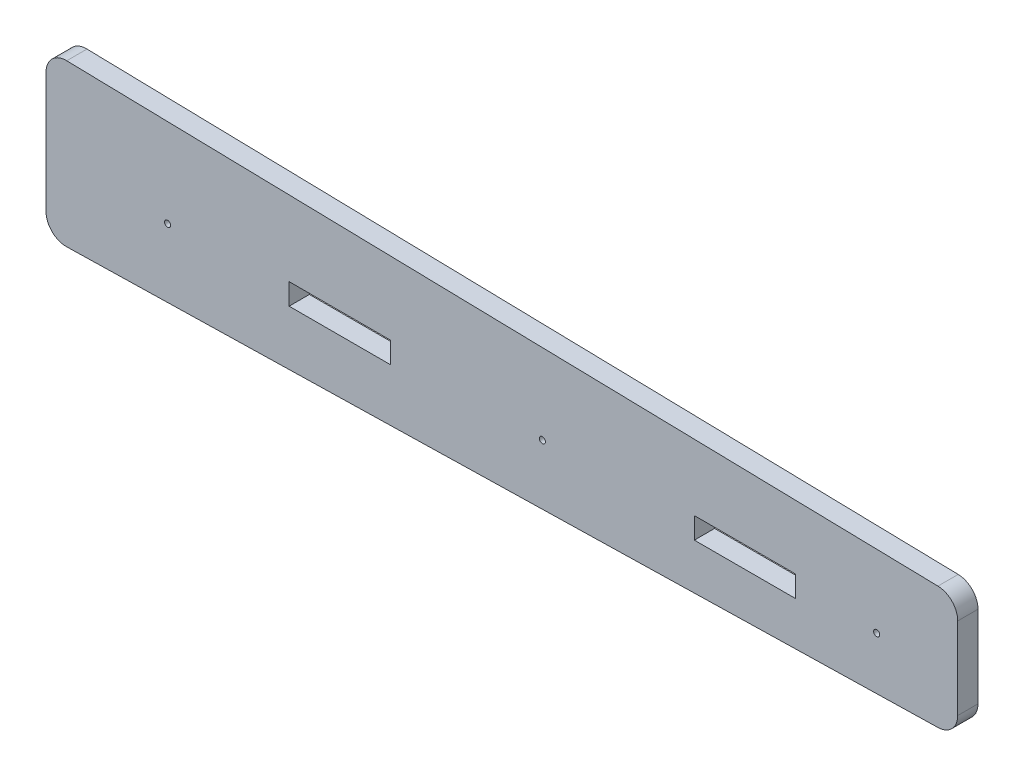
ISO-10303-21;
HEADER;
FILE_DESCRIPTION(('STEP AP214'),'2;1');
FILE_NAME('part.step','',(''),(''),'','','');
FILE_SCHEMA(('AUTOMOTIVE_DESIGN { 1 0 10303 214 1 1 1 1 }'));
ENDSEC;
DATA;
#1=APPLICATION_CONTEXT('core data for automotive mechanical design processes');
#2=APPLICATION_PROTOCOL_DEFINITION('international standard','automotive_design',2000,#1);
#3=PRODUCT_CONTEXT('',#1,'mechanical');
#4=PRODUCT('Part','Part','',(#3));
#5=PRODUCT_RELATED_PRODUCT_CATEGORY('part','',(#4));
#6=PRODUCT_DEFINITION_FORMATION('','',#4);
#7=PRODUCT_DEFINITION_CONTEXT('part definition',#1,'design');
#8=PRODUCT_DEFINITION('design','',#6,#7);
#9=PRODUCT_DEFINITION_SHAPE('','',#8);
#10=(LENGTH_UNIT() NAMED_UNIT(*) SI_UNIT(.MILLI.,.METRE.));
#11=(NAMED_UNIT(*) PLANE_ANGLE_UNIT() SI_UNIT($,.RADIAN.));
#12=(NAMED_UNIT(*) SI_UNIT($,.STERADIAN.) SOLID_ANGLE_UNIT());
#13=UNCERTAINTY_MEASURE_WITH_UNIT(LENGTH_MEASURE(1.E-05),#10,'distance_accuracy_value','');
#14=(GEOMETRIC_REPRESENTATION_CONTEXT(3) GLOBAL_UNCERTAINTY_ASSIGNED_CONTEXT((#13)) GLOBAL_UNIT_ASSIGNED_CONTEXT((#10,
#11,#12)) REPRESENTATION_CONTEXT('',''));
#15=CARTESIAN_POINT('',(0.,0.,0.));
#16=DIRECTION('',(0.,0.,1.));
#17=DIRECTION('',(1.,0.,0.));
#18=AXIS2_PLACEMENT_3D('',#15,#16,#17);
#19=CARTESIAN_POINT('',(0.,0.,10.));
#20=DIRECTION('',(0.,0.,1.));
#21=DIRECTION('',(1.,0.,0.));
#22=AXIS2_PLACEMENT_3D('',#19,#20,#21);
#23=PLANE('',#22);
#24=CARTESIAN_POINT('',(-165.,-5.,10.));
#25=DIRECTION('',(0.,0.,1.));
#26=DIRECTION('',(1.,0.,0.));
#27=AXIS2_PLACEMENT_3D('',#24,#25,#26);
#28=CIRCLE('',#27,1.5);
#29=CARTESIAN_POINT('',(-163.5,-5.,10.));
#30=VERTEX_POINT('',#29);
#31=EDGE_CURVE('E508',#30,#30,#28,.T.);
#32=ORIENTED_EDGE('',*,*,#31,.F.);
#33=EDGE_LOOP('',(#32));
#34=FACE_BOUND('',#33,.T.);
#35=CARTESIAN_POINT('',(20.,-5.,10.));
#36=DIRECTION('',(0.,0.,1.));
#37=DIRECTION('',(1.,0.,0.));
#38=AXIS2_PLACEMENT_3D('',#35,#36,#37);
#39=CIRCLE('',#38,1.5);
#40=CARTESIAN_POINT('',(21.5,-5.,10.));
#41=VERTEX_POINT('',#40);
#42=EDGE_CURVE('E515',#41,#41,#39,.T.);
#43=ORIENTED_EDGE('',*,*,#42,.F.);
#44=EDGE_LOOP('',(#43));
#45=FACE_BOUND('',#44,.T.);
#46=CARTESIAN_POINT('',(185.,-5.,10.));
#47=DIRECTION('',(0.,0.,1.));
#48=DIRECTION('',(1.,0.,0.));
#49=AXIS2_PLACEMENT_3D('',#46,#47,#48);
#50=CIRCLE('',#49,1.5);
#51=CARTESIAN_POINT('',(186.5,-5.,10.));
#52=VERTEX_POINT('',#51);
#53=EDGE_CURVE('E521',#52,#52,#50,.T.);
#54=ORIENTED_EDGE('',*,*,#53,.F.);
#55=EDGE_LOOP('',(#54));
#56=FACE_BOUND('',#55,.T.);
#57=DIRECTION('',(0.,-1.,0.));
#58=VECTOR('',#57,1.);
#59=CARTESIAN_POINT('',(-225.,40.,10.));
#60=LINE('',#59,#58);
#61=CARTESIAN_POINT('',(-225.,29.7753089467316,10.));
#62=VERTEX_POINT('',#61);
#63=CARTESIAN_POINT('',(-225.,-29.7753089467316,10.));
#64=VERTEX_POINT('',#63);
#65=EDGE_CURVE('E225',#62,#64,#60,.T.);
#66=ORIENTED_EDGE('',*,*,#65,.T.);
#67=CARTESIAN_POINT('',(-215.,-29.7753089467316,10.));
#68=DIRECTION('',(0.,0.,1.));
#69=DIRECTION('',(1.,0.,0.));
#70=AXIS2_PLACEMENT_3D('',#67,#68,#69);
#71=CIRCLE('',#70,10.);
#72=CARTESIAN_POINT('',(-214.777832627149,-39.7728407250478,10.));
#73=VERTEX_POINT('',#72);
#74=EDGE_CURVE('E265',#64,#73,#71,.T.);
#75=ORIENTED_EDGE('',*,*,#74,.T.);
#76=DIRECTION('',(0.99975317783161,0.0222167372851469,0.));
#77=VECTOR('',#76,1.);
#78=CARTESIAN_POINT('',(-225.,-40.,10.));
#79=LINE('',#78,#77);
#80=CARTESIAN_POINT('',(215.222167372851,-30.2172851694922,10.));
#81=VERTEX_POINT('',#80);
#82=EDGE_CURVE('E229',#73,#81,#79,.T.);
#83=ORIENTED_EDGE('',*,*,#82,.T.);
#84=CARTESIAN_POINT('',(215.,-20.2197533911761,10.));
#85=DIRECTION('',(0.,0.,1.));
#86=DIRECTION('',(1.,0.,0.));
#87=AXIS2_PLACEMENT_3D('',#84,#85,#86);
#88=CIRCLE('',#87,10.);
#89=CARTESIAN_POINT('',(225.,-20.2197533911761,10.));
#90=VERTEX_POINT('',#89);
#91=EDGE_CURVE('E54',#81,#90,#88,.T.);
#92=ORIENTED_EDGE('',*,*,#91,.T.);
#93=DIRECTION('',(0.,1.,0.));
#94=VECTOR('',#93,1.);
#95=CARTESIAN_POINT('',(225.,-30.,10.));
#96=LINE('',#95,#94);
#97=CARTESIAN_POINT('',(225.,20.2197533911761,10.));
#98=VERTEX_POINT('',#97);
#99=EDGE_CURVE('E231',#90,#98,#96,.T.);
#100=ORIENTED_EDGE('',*,*,#99,.T.);
#101=CARTESIAN_POINT('',(215.,20.2197533911761,10.));
#102=DIRECTION('',(0.,0.,1.));
#103=DIRECTION('',(1.,0.,0.));
#104=AXIS2_PLACEMENT_3D('',#101,#102,#103);
#105=CIRCLE('',#104,10.);
#106=CARTESIAN_POINT('',(215.222167372851,30.2172851694922,10.));
#107=VERTEX_POINT('',#106);
#108=EDGE_CURVE('E260',#98,#107,#105,.T.);
#109=ORIENTED_EDGE('',*,*,#108,.T.);
#110=DIRECTION('',(-0.99975317783161,0.0222167372851469,0.));
#111=VECTOR('',#110,1.);
#112=CARTESIAN_POINT('',(225.,30.,10.));
#113=LINE('',#112,#111);
#114=CARTESIAN_POINT('',(-214.777832627149,39.7728407250478,10.));
#115=VERTEX_POINT('',#114);
#116=EDGE_CURVE('E222',#107,#115,#113,.T.);
#117=ORIENTED_EDGE('',*,*,#116,.T.);
#118=CARTESIAN_POINT('',(-215.,29.7753089467316,10.));
#119=DIRECTION('',(0.,0.,1.));
#120=DIRECTION('',(1.,0.,0.));
#121=AXIS2_PLACEMENT_3D('',#118,#119,#120);
#122=CIRCLE('',#121,10.);
#123=EDGE_CURVE('E263',#115,#62,#122,.T.);
#124=ORIENTED_EDGE('',*,*,#123,.T.);
#125=EDGE_LOOP('',(#66,#75,#83,#92,#100,#109,#117,#124));
#126=FACE_BOUND('',#125,.T.);
#127=DIRECTION('',(-1.,0.,0.));
#128=VECTOR('',#127,1.);
#129=CARTESIAN_POINT('',(-105.,0.249999999999996,10.));
#130=LINE('',#129,#128);
#131=CARTESIAN_POINT('',(-54.9999999999999,0.249999999999996,10.));
#132=VERTEX_POINT('',#131);
#133=CARTESIAN_POINT('',(-105.,0.249999999999996,10.));
#134=VERTEX_POINT('',#133);
#135=EDGE_CURVE('E193',#132,#134,#130,.T.);
#136=ORIENTED_EDGE('',*,*,#135,.F.);
#137=DIRECTION('',(0.,1.,0.));
#138=VECTOR('',#137,1.);
#139=CARTESIAN_POINT('',(-54.9999999999999,0.249999999999996,10.));
#140=LINE('',#139,#138);
#141=CARTESIAN_POINT('',(-54.9999999999999,-10.25,10.));
#142=VERTEX_POINT('',#141);
#143=EDGE_CURVE('E191',#142,#132,#140,.T.);
#144=ORIENTED_EDGE('',*,*,#143,.F.);
#145=DIRECTION('',(1.,0.,0.));
#146=VECTOR('',#145,1.);
#147=CARTESIAN_POINT('',(-105.,-10.25,10.));
#148=LINE('',#147,#146);
#149=CARTESIAN_POINT('',(-105.,-10.25,10.));
#150=VERTEX_POINT('',#149);
#151=EDGE_CURVE('E199',#150,#142,#148,.T.);
#152=ORIENTED_EDGE('',*,*,#151,.F.);
#153=DIRECTION('',(0.,-1.,0.));
#154=VECTOR('',#153,1.);
#155=CARTESIAN_POINT('',(-105.,0.249999999999996,10.));
#156=LINE('',#155,#154);
#157=EDGE_CURVE('E196',#134,#150,#156,.T.);
#158=ORIENTED_EDGE('',*,*,#157,.F.);
#159=EDGE_LOOP('',(#136,#144,#152,#158));
#160=FACE_BOUND('',#159,.T.);
#161=DIRECTION('',(-1.,0.,0.));
#162=VECTOR('',#161,1.);
#163=CARTESIAN_POINT('',(95.0000000000001,0.249999999999996,10.));
#164=LINE('',#163,#162);
#165=CARTESIAN_POINT('',(145.,0.249999999999996,10.));
#166=VERTEX_POINT('',#165);
#167=CARTESIAN_POINT('',(95.0000000000001,0.249999999999996,10.));
#168=VERTEX_POINT('',#167);
#169=EDGE_CURVE('E158',#166,#168,#164,.T.);
#170=ORIENTED_EDGE('',*,*,#169,.F.);
#171=DIRECTION('',(0.,1.,0.));
#172=VECTOR('',#171,1.);
#173=CARTESIAN_POINT('',(145.,0.249999999999996,10.));
#174=LINE('',#173,#172);
#175=CARTESIAN_POINT('',(145.,-10.25,10.));
#176=VERTEX_POINT('',#175);
#177=EDGE_CURVE('E148',#176,#166,#174,.T.);
#178=ORIENTED_EDGE('',*,*,#177,.F.);
#179=DIRECTION('',(1.,0.,0.));
#180=VECTOR('',#179,1.);
#181=CARTESIAN_POINT('',(95.0000000000001,-10.25,10.));
#182=LINE('',#181,#180);
#183=CARTESIAN_POINT('',(95.0000000000001,-10.25,10.));
#184=VERTEX_POINT('',#183);
#185=EDGE_CURVE('E173',#184,#176,#182,.T.);
#186=ORIENTED_EDGE('',*,*,#185,.F.);
#187=DIRECTION('',(0.,-1.,0.));
#188=VECTOR('',#187,1.);
#189=CARTESIAN_POINT('',(95.0000000000001,0.249999999999996,10.));
#190=LINE('',#189,#188);
#191=EDGE_CURVE('E171',#168,#184,#190,.T.);
#192=ORIENTED_EDGE('',*,*,#191,.F.);
#193=EDGE_LOOP('',(#170,#178,#186,#192));
#194=FACE_BOUND('',#193,.T.);
#195=ADVANCED_FACE('F33',(#34,#45,#56,#126,#160,#194),#23,.T.);
#196=CARTESIAN_POINT('',(0.,0.,0.));
#197=DIRECTION('',(0.,0.,1.));
#198=DIRECTION('',(1.,0.,0.));
#199=AXIS2_PLACEMENT_3D('',#196,#197,#198);
#200=PLANE('',#199);
#201=CARTESIAN_POINT('',(-165.,-5.,0.));
#202=DIRECTION('',(0.,0.,1.));
#203=DIRECTION('',(1.,0.,0.));
#204=AXIS2_PLACEMENT_3D('',#201,#202,#203);
#205=CIRCLE('',#204,1.5);
#206=CARTESIAN_POINT('',(-163.5,-5.,0.));
#207=VERTEX_POINT('',#206);
#208=EDGE_CURVE('E180',#207,#207,#205,.F.);
#209=ORIENTED_EDGE('',*,*,#208,.F.);
#210=EDGE_LOOP('',(#209));
#211=FACE_BOUND('',#210,.T.);
#212=CARTESIAN_POINT('',(20.,-5.,0.));
#213=DIRECTION('',(0.,0.,1.));
#214=DIRECTION('',(1.,0.,0.));
#215=AXIS2_PLACEMENT_3D('',#212,#213,#214);
#216=CIRCLE('',#215,1.5);
#217=CARTESIAN_POINT('',(21.5,-5.,0.));
#218=VERTEX_POINT('',#217);
#219=EDGE_CURVE('E512',#218,#218,#216,.F.);
#220=ORIENTED_EDGE('',*,*,#219,.F.);
#221=EDGE_LOOP('',(#220));
#222=FACE_BOUND('',#221,.T.);
#223=CARTESIAN_POINT('',(185.,-5.,0.));
#224=DIRECTION('',(0.,0.,1.));
#225=DIRECTION('',(1.,0.,0.));
#226=AXIS2_PLACEMENT_3D('',#223,#224,#225);
#227=CIRCLE('',#226,1.5);
#228=CARTESIAN_POINT('',(186.5,-5.,0.));
#229=VERTEX_POINT('',#228);
#230=EDGE_CURVE('E518',#229,#229,#227,.F.);
#231=ORIENTED_EDGE('',*,*,#230,.F.);
#232=EDGE_LOOP('',(#231));
#233=FACE_BOUND('',#232,.T.);
#234=DIRECTION('',(0.,1.,0.));
#235=VECTOR('',#234,1.);
#236=CARTESIAN_POINT('',(-54.9999999999999,0.249999999999996,0.));
#237=LINE('',#236,#235);
#238=CARTESIAN_POINT('',(-54.9999999999999,-10.25,0.));
#239=VERTEX_POINT('',#238);
#240=CARTESIAN_POINT('',(-54.9999999999999,0.249999999999996,0.));
#241=VERTEX_POINT('',#240);
#242=EDGE_CURVE('E166',#239,#241,#237,.T.);
#243=ORIENTED_EDGE('',*,*,#242,.T.);
#244=DIRECTION('',(-1.,0.,0.));
#245=VECTOR('',#244,1.);
#246=CARTESIAN_POINT('',(-105.,0.249999999999996,0.));
#247=LINE('',#246,#245);
#248=CARTESIAN_POINT('',(-105.,0.249999999999996,0.));
#249=VERTEX_POINT('',#248);
#250=EDGE_CURVE('E204',#241,#249,#247,.T.);
#251=ORIENTED_EDGE('',*,*,#250,.T.);
#252=DIRECTION('',(0.,-1.,0.));
#253=VECTOR('',#252,1.);
#254=CARTESIAN_POINT('',(-105.,0.249999999999996,0.));
#255=LINE('',#254,#253);
#256=CARTESIAN_POINT('',(-105.,-10.25,0.));
#257=VERTEX_POINT('',#256);
#258=EDGE_CURVE('E207',#249,#257,#255,.T.);
#259=ORIENTED_EDGE('',*,*,#258,.T.);
#260=DIRECTION('',(1.,0.,0.));
#261=VECTOR('',#260,1.);
#262=CARTESIAN_POINT('',(-105.,-10.25,0.));
#263=LINE('',#262,#261);
#264=EDGE_CURVE('E194',#257,#239,#263,.T.);
#265=ORIENTED_EDGE('',*,*,#264,.T.);
#266=EDGE_LOOP('',(#243,#251,#259,#265));
#267=FACE_BOUND('',#266,.T.);
#268=DIRECTION('',(0.99975317783161,0.0222167372851469,0.));
#269=VECTOR('',#268,1.);
#270=CARTESIAN_POINT('',(-225.,-40.,0.));
#271=LINE('',#270,#269);
#272=CARTESIAN_POINT('',(-214.777832627149,-39.7728407250478,0.));
#273=VERTEX_POINT('',#272);
#274=CARTESIAN_POINT('',(215.222167372851,-30.2172851694922,0.));
#275=VERTEX_POINT('',#274);
#276=EDGE_CURVE('E239',#273,#275,#271,.T.);
#277=ORIENTED_EDGE('',*,*,#276,.F.);
#278=CARTESIAN_POINT('',(-215.,-29.7753089467316,0.));
#279=DIRECTION('',(0.,0.,1.));
#280=DIRECTION('',(1.,0.,0.));
#281=AXIS2_PLACEMENT_3D('',#278,#279,#280);
#282=CIRCLE('',#281,10.);
#283=CARTESIAN_POINT('',(-225.,-29.7753089467316,0.));
#284=VERTEX_POINT('',#283);
#285=EDGE_CURVE('E253',#273,#284,#282,.F.);
#286=ORIENTED_EDGE('',*,*,#285,.T.);
#287=DIRECTION('',(0.,-1.,0.));
#288=VECTOR('',#287,1.);
#289=CARTESIAN_POINT('',(-225.,40.,0.));
#290=LINE('',#289,#288);
#291=CARTESIAN_POINT('',(-225.,29.7753089467316,0.));
#292=VERTEX_POINT('',#291);
#293=EDGE_CURVE('E236',#292,#284,#290,.T.);
#294=ORIENTED_EDGE('',*,*,#293,.F.);
#295=CARTESIAN_POINT('',(-215.,29.7753089467316,0.));
#296=DIRECTION('',(0.,0.,1.));
#297=DIRECTION('',(1.,0.,0.));
#298=AXIS2_PLACEMENT_3D('',#295,#296,#297);
#299=CIRCLE('',#298,10.);
#300=CARTESIAN_POINT('',(-214.777832627149,39.7728407250478,0.));
#301=VERTEX_POINT('',#300);
#302=EDGE_CURVE('E251',#292,#301,#299,.F.);
#303=ORIENTED_EDGE('',*,*,#302,.T.);
#304=DIRECTION('',(-0.99975317783161,0.0222167372851469,0.));
#305=VECTOR('',#304,1.);
#306=CARTESIAN_POINT('',(225.,30.,0.));
#307=LINE('',#306,#305);
#308=CARTESIAN_POINT('',(215.222167372851,30.2172851694922,0.));
#309=VERTEX_POINT('',#308);
#310=EDGE_CURVE('E221',#309,#301,#307,.T.);
#311=ORIENTED_EDGE('',*,*,#310,.F.);
#312=CARTESIAN_POINT('',(215.,20.2197533911761,0.));
#313=DIRECTION('',(0.,0.,1.));
#314=DIRECTION('',(1.,0.,0.));
#315=AXIS2_PLACEMENT_3D('',#312,#313,#314);
#316=CIRCLE('',#315,10.);
#317=CARTESIAN_POINT('',(225.,20.2197533911761,0.));
#318=VERTEX_POINT('',#317);
#319=EDGE_CURVE('E247',#309,#318,#316,.F.);
#320=ORIENTED_EDGE('',*,*,#319,.T.);
#321=DIRECTION('',(0.,1.,0.));
#322=VECTOR('',#321,1.);
#323=CARTESIAN_POINT('',(225.,-30.,0.));
#324=LINE('',#323,#322);
#325=CARTESIAN_POINT('',(225.,-20.2197533911761,0.));
#326=VERTEX_POINT('',#325);
#327=EDGE_CURVE('E226',#326,#318,#324,.T.);
#328=ORIENTED_EDGE('',*,*,#327,.F.);
#329=CARTESIAN_POINT('',(215.,-20.2197533911761,0.));
#330=DIRECTION('',(0.,0.,1.));
#331=DIRECTION('',(1.,0.,0.));
#332=AXIS2_PLACEMENT_3D('',#329,#330,#331);
#333=CIRCLE('',#332,10.);
#334=EDGE_CURVE('E249',#326,#275,#333,.F.);
#335=ORIENTED_EDGE('',*,*,#334,.T.);
#336=EDGE_LOOP('',(#277,#286,#294,#303,#311,#320,#328,#335));
#337=FACE_BOUND('',#336,.T.);
#338=DIRECTION('',(0.,1.,0.));
#339=VECTOR('',#338,1.);
#340=CARTESIAN_POINT('',(145.,0.249999999999996,0.));
#341=LINE('',#340,#339);
#342=CARTESIAN_POINT('',(145.,-10.25,0.));
#343=VERTEX_POINT('',#342);
#344=CARTESIAN_POINT('',(145.,0.249999999999996,0.));
#345=VERTEX_POINT('',#344);
#346=EDGE_CURVE('E178',#343,#345,#341,.T.);
#347=ORIENTED_EDGE('',*,*,#346,.T.);
#348=DIRECTION('',(-1.,0.,0.));
#349=VECTOR('',#348,1.);
#350=CARTESIAN_POINT('',(95.0000000000001,0.249999999999996,0.));
#351=LINE('',#350,#349);
#352=CARTESIAN_POINT('',(95.0000000000001,0.249999999999996,0.));
#353=VERTEX_POINT('',#352);
#354=EDGE_CURVE('E165',#345,#353,#351,.T.);
#355=ORIENTED_EDGE('',*,*,#354,.T.);
#356=DIRECTION('',(0.,-1.,0.));
#357=VECTOR('',#356,1.);
#358=CARTESIAN_POINT('',(95.0000000000001,0.249999999999996,0.));
#359=LINE('',#358,#357);
#360=CARTESIAN_POINT('',(95.0000000000001,-10.25,0.));
#361=VERTEX_POINT('',#360);
#362=EDGE_CURVE('E182',#353,#361,#359,.T.);
#363=ORIENTED_EDGE('',*,*,#362,.T.);
#364=DIRECTION('',(1.,0.,0.));
#365=VECTOR('',#364,1.);
#366=CARTESIAN_POINT('',(95.0000000000001,-10.25,0.));
#367=LINE('',#366,#365);
#368=EDGE_CURVE('E159',#361,#343,#367,.T.);
#369=ORIENTED_EDGE('',*,*,#368,.T.);
#370=EDGE_LOOP('',(#347,#355,#363,#369));
#371=FACE_BOUND('',#370,.T.);
#372=ADVANCED_FACE('F290',(#211,#222,#233,#267,#337,#371),#200,.F.);
#373=CARTESIAN_POINT('',(225.,30.,10.));
#374=DIRECTION('',(-0.0222167372851469,-0.99975317783161,0.));
#375=DIRECTION('',(0.99975317783161,-0.0222167372851469,0.));
#376=AXIS2_PLACEMENT_3D('',#373,#374,#375);
#377=PLANE('',#376);
#378=ORIENTED_EDGE('',*,*,#310,.T.);
#379=DIRECTION('',(0.,0.,-1.));
#380=VECTOR('',#379,1.);
#381=CARTESIAN_POINT('',(-214.777832627149,39.7728407250478,10.));
#382=LINE('',#381,#380);
#383=EDGE_CURVE('E270',#301,#115,#382,.F.);
#384=ORIENTED_EDGE('',*,*,#383,.T.);
#385=ORIENTED_EDGE('',*,*,#116,.F.);
#386=DIRECTION('',(0.,0.,-1.));
#387=VECTOR('',#386,1.);
#388=CARTESIAN_POINT('',(215.222167372851,30.2172851694922,10.));
#389=LINE('',#388,#387);
#390=EDGE_CURVE('E267',#107,#309,#389,.T.);
#391=ORIENTED_EDGE('',*,*,#390,.T.);
#392=EDGE_LOOP('',(#378,#384,#385,#391));
#393=FACE_BOUND('',#392,.T.);
#394=ADVANCED_FACE('F274',(#393),#377,.F.);
#395=CARTESIAN_POINT('',(-225.,40.,10.));
#396=DIRECTION('',(1.,0.,0.));
#397=DIRECTION('',(0.,0.,-1.));
#398=AXIS2_PLACEMENT_3D('',#395,#396,#397);
#399=PLANE('',#398);
#400=ORIENTED_EDGE('',*,*,#293,.T.);
#401=DIRECTION('',(0.,0.,-1.));
#402=VECTOR('',#401,1.);
#403=CARTESIAN_POINT('',(-225.,-29.7753089467316,10.));
#404=LINE('',#403,#402);
#405=EDGE_CURVE('E258',#284,#64,#404,.F.);
#406=ORIENTED_EDGE('',*,*,#405,.T.);
#407=ORIENTED_EDGE('',*,*,#65,.F.);
#408=DIRECTION('',(0.,0.,-1.));
#409=VECTOR('',#408,1.);
#410=CARTESIAN_POINT('',(-225.,29.7753089467316,10.));
#411=LINE('',#410,#409);
#412=EDGE_CURVE('E255',#62,#292,#411,.T.);
#413=ORIENTED_EDGE('',*,*,#412,.T.);
#414=EDGE_LOOP('',(#400,#406,#407,#413));
#415=FACE_BOUND('',#414,.T.);
#416=ADVANCED_FACE('F286',(#415),#399,.F.);
#417=CARTESIAN_POINT('',(-225.,-40.,10.));
#418=DIRECTION('',(-0.0222167372851469,0.99975317783161,0.));
#419=DIRECTION('',(-0.99975317783161,-0.0222167372851469,0.));
#420=AXIS2_PLACEMENT_3D('',#417,#418,#419);
#421=PLANE('',#420);
#422=ORIENTED_EDGE('',*,*,#82,.F.);
#423=DIRECTION('',(0.,0.,-1.));
#424=VECTOR('',#423,1.);
#425=CARTESIAN_POINT('',(-214.777832627149,-39.7728407250478,10.));
#426=LINE('',#425,#424);
#427=EDGE_CURVE('E244',#73,#273,#426,.T.);
#428=ORIENTED_EDGE('',*,*,#427,.T.);
#429=ORIENTED_EDGE('',*,*,#276,.T.);
#430=DIRECTION('',(0.,0.,-1.));
#431=VECTOR('',#430,1.);
#432=CARTESIAN_POINT('',(215.222167372851,-30.2172851694922,10.));
#433=LINE('',#432,#431);
#434=EDGE_CURVE('E233',#275,#81,#433,.F.);
#435=ORIENTED_EDGE('',*,*,#434,.T.);
#436=EDGE_LOOP('',(#422,#428,#429,#435));
#437=FACE_BOUND('',#436,.T.);
#438=ADVANCED_FACE('F298',(#437),#421,.F.);
#439=CARTESIAN_POINT('',(225.,-30.,10.));
#440=DIRECTION('',(-1.,0.,0.));
#441=DIRECTION('',(0.,0.,1.));
#442=AXIS2_PLACEMENT_3D('',#439,#440,#441);
#443=PLANE('',#442);
#444=ORIENTED_EDGE('',*,*,#99,.F.);
#445=DIRECTION('',(0.,0.,-1.));
#446=VECTOR('',#445,1.);
#447=CARTESIAN_POINT('',(225.,-20.2197533911761,10.));
#448=LINE('',#447,#446);
#449=EDGE_CURVE('E11',#90,#326,#448,.T.);
#450=ORIENTED_EDGE('',*,*,#449,.T.);
#451=ORIENTED_EDGE('',*,*,#327,.T.);
#452=DIRECTION('',(0.,0.,-1.));
#453=VECTOR('',#452,1.);
#454=CARTESIAN_POINT('',(225.,20.2197533911761,10.));
#455=LINE('',#454,#453);
#456=EDGE_CURVE('E41',#318,#98,#455,.F.);
#457=ORIENTED_EDGE('',*,*,#456,.T.);
#458=EDGE_LOOP('',(#444,#450,#451,#457));
#459=FACE_BOUND('',#458,.T.);
#460=ADVANCED_FACE('F304',(#459),#443,.F.);
#461=CARTESIAN_POINT('',(-54.9999999999999,0.249999999999996,10.));
#462=DIRECTION('',(-1.,0.,0.));
#463=DIRECTION('',(0.,-1.,0.));
#464=AXIS2_PLACEMENT_3D('',#461,#462,#463);
#465=PLANE('',#464);
#466=ORIENTED_EDGE('',*,*,#242,.F.);
#467=DIRECTION('',(0.,0.,-1.));
#468=VECTOR('',#467,1.);
#469=CARTESIAN_POINT('',(-54.9999999999999,-10.25,10.));
#470=LINE('',#469,#468);
#471=EDGE_CURVE('E201',#142,#239,#470,.T.);
#472=ORIENTED_EDGE('',*,*,#471,.F.);
#473=ORIENTED_EDGE('',*,*,#143,.T.);
#474=DIRECTION('',(0.,0.,-1.));
#475=VECTOR('',#474,1.);
#476=CARTESIAN_POINT('',(-54.9999999999999,0.249999999999996,10.));
#477=LINE('',#476,#475);
#478=EDGE_CURVE('E218',#132,#241,#477,.T.);
#479=ORIENTED_EDGE('',*,*,#478,.T.);
#480=EDGE_LOOP('',(#466,#472,#473,#479));
#481=FACE_BOUND('',#480,.T.);
#482=ADVANCED_FACE('F326',(#481),#465,.T.);
#483=CARTESIAN_POINT('',(-105.,0.249999999999996,10.));
#484=DIRECTION('',(0.,-1.,0.));
#485=DIRECTION('',(0.,0.,-1.));
#486=AXIS2_PLACEMENT_3D('',#483,#484,#485);
#487=PLANE('',#486);
#488=ORIENTED_EDGE('',*,*,#250,.F.);
#489=ORIENTED_EDGE('',*,*,#478,.F.);
#490=ORIENTED_EDGE('',*,*,#135,.T.);
#491=DIRECTION('',(0.,0.,-1.));
#492=VECTOR('',#491,1.);
#493=CARTESIAN_POINT('',(-105.,0.249999999999996,10.));
#494=LINE('',#493,#492);
#495=EDGE_CURVE('E216',#134,#249,#494,.T.);
#496=ORIENTED_EDGE('',*,*,#495,.T.);
#497=EDGE_LOOP('',(#488,#489,#490,#496));
#498=FACE_BOUND('',#497,.T.);
#499=ADVANCED_FACE('F413',(#498),#487,.T.);
#500=CARTESIAN_POINT('',(-105.,0.249999999999996,10.));
#501=DIRECTION('',(1.,0.,0.));
#502=DIRECTION('',(0.,0.,-1.));
#503=AXIS2_PLACEMENT_3D('',#500,#501,#502);
#504=PLANE('',#503);
#505=ORIENTED_EDGE('',*,*,#258,.F.);
#506=ORIENTED_EDGE('',*,*,#495,.F.);
#507=ORIENTED_EDGE('',*,*,#157,.T.);
#508=DIRECTION('',(0.,0.,-1.));
#509=VECTOR('',#508,1.);
#510=CARTESIAN_POINT('',(-105.,-10.25,10.));
#511=LINE('',#510,#509);
#512=EDGE_CURVE('E214',#150,#257,#511,.T.);
#513=ORIENTED_EDGE('',*,*,#512,.T.);
#514=EDGE_LOOP('',(#505,#506,#507,#513));
#515=FACE_BOUND('',#514,.T.);
#516=ADVANCED_FACE('F410',(#515),#504,.T.);
#517=CARTESIAN_POINT('',(-105.,-10.25,10.));
#518=DIRECTION('',(0.,1.,0.));
#519=DIRECTION('',(0.,0.,1.));
#520=AXIS2_PLACEMENT_3D('',#517,#518,#519);
#521=PLANE('',#520);
#522=ORIENTED_EDGE('',*,*,#264,.F.);
#523=ORIENTED_EDGE('',*,*,#512,.F.);
#524=ORIENTED_EDGE('',*,*,#151,.T.);
#525=ORIENTED_EDGE('',*,*,#471,.T.);
#526=EDGE_LOOP('',(#522,#523,#524,#525));
#527=FACE_BOUND('',#526,.T.);
#528=ADVANCED_FACE('F407',(#527),#521,.T.);
#529=CARTESIAN_POINT('',(145.,0.249999999999996,10.));
#530=DIRECTION('',(-1.,0.,0.));
#531=DIRECTION('',(0.,0.,1.));
#532=AXIS2_PLACEMENT_3D('',#529,#530,#531);
#533=PLANE('',#532);
#534=ORIENTED_EDGE('',*,*,#346,.F.);
#535=DIRECTION('',(0.,0.,-1.));
#536=VECTOR('',#535,1.);
#537=CARTESIAN_POINT('',(145.,-10.25,10.));
#538=LINE('',#537,#536);
#539=EDGE_CURVE('E154',#176,#343,#538,.T.);
#540=ORIENTED_EDGE('',*,*,#539,.F.);
#541=ORIENTED_EDGE('',*,*,#177,.T.);
#542=DIRECTION('',(0.,0.,-1.));
#543=VECTOR('',#542,1.);
#544=CARTESIAN_POINT('',(145.,0.249999999999996,10.));
#545=LINE('',#544,#543);
#546=EDGE_CURVE('E151',#166,#345,#545,.T.);
#547=ORIENTED_EDGE('',*,*,#546,.T.);
#548=EDGE_LOOP('',(#534,#540,#541,#547));
#549=FACE_BOUND('',#548,.T.);
#550=ADVANCED_FACE('F150',(#549),#533,.T.);
#551=CARTESIAN_POINT('',(95.0000000000001,0.249999999999996,10.));
#552=DIRECTION('',(0.,-1.,0.));
#553=DIRECTION('',(0.,0.,-1.));
#554=AXIS2_PLACEMENT_3D('',#551,#552,#553);
#555=PLANE('',#554);
#556=ORIENTED_EDGE('',*,*,#354,.F.);
#557=ORIENTED_EDGE('',*,*,#546,.F.);
#558=ORIENTED_EDGE('',*,*,#169,.T.);
#559=DIRECTION('',(0.,0.,-1.));
#560=VECTOR('',#559,1.);
#561=CARTESIAN_POINT('',(95.0000000000001,0.249999999999996,10.));
#562=LINE('',#561,#560);
#563=EDGE_CURVE('E167',#168,#353,#562,.T.);
#564=ORIENTED_EDGE('',*,*,#563,.T.);
#565=EDGE_LOOP('',(#556,#557,#558,#564));
#566=FACE_BOUND('',#565,.T.);
#567=ADVANCED_FACE('F162',(#566),#555,.T.);
#568=CARTESIAN_POINT('',(95.0000000000001,0.249999999999996,10.));
#569=DIRECTION('',(1.,0.,0.));
#570=DIRECTION('',(0.,0.,-1.));
#571=AXIS2_PLACEMENT_3D('',#568,#569,#570);
#572=PLANE('',#571);
#573=ORIENTED_EDGE('',*,*,#362,.F.);
#574=ORIENTED_EDGE('',*,*,#563,.F.);
#575=ORIENTED_EDGE('',*,*,#191,.T.);
#576=DIRECTION('',(0.,0.,-1.));
#577=VECTOR('',#576,1.);
#578=CARTESIAN_POINT('',(95.0000000000001,-10.25,10.));
#579=LINE('',#578,#577);
#580=EDGE_CURVE('E188',#184,#361,#579,.T.);
#581=ORIENTED_EDGE('',*,*,#580,.T.);
#582=EDGE_LOOP('',(#573,#574,#575,#581));
#583=FACE_BOUND('',#582,.T.);
#584=ADVANCED_FACE('F398',(#583),#572,.T.);
#585=CARTESIAN_POINT('',(95.0000000000001,-10.25,10.));
#586=DIRECTION('',(0.,1.,0.));
#587=DIRECTION('',(-1.,0.,0.));
#588=AXIS2_PLACEMENT_3D('',#585,#586,#587);
#589=PLANE('',#588);
#590=ORIENTED_EDGE('',*,*,#368,.F.);
#591=ORIENTED_EDGE('',*,*,#580,.F.);
#592=ORIENTED_EDGE('',*,*,#185,.T.);
#593=ORIENTED_EDGE('',*,*,#539,.T.);
#594=EDGE_LOOP('',(#590,#591,#592,#593));
#595=FACE_BOUND('',#594,.T.);
#596=ADVANCED_FACE('F339',(#595),#589,.T.);
#597=CARTESIAN_POINT('',(-215.,-29.7753089467316,10.));
#598=DIRECTION('',(0.,0.,-1.));
#599=DIRECTION('',(-1.,0.,0.));
#600=AXIS2_PLACEMENT_3D('',#597,#598,#599);
#601=CYLINDRICAL_SURFACE('',#600,10.);
#602=ORIENTED_EDGE('',*,*,#74,.F.);
#603=ORIENTED_EDGE('',*,*,#405,.F.);
#604=ORIENTED_EDGE('',*,*,#285,.F.);
#605=ORIENTED_EDGE('',*,*,#427,.F.);
#606=EDGE_LOOP('',(#602,#603,#604,#605));
#607=FACE_BOUND('',#606,.T.);
#608=ADVANCED_FACE('F295',(#607),#601,.T.);
#609=CARTESIAN_POINT('',(-215.,29.7753089467316,10.));
#610=DIRECTION('',(0.,0.,-1.));
#611=DIRECTION('',(-1.,0.,0.));
#612=AXIS2_PLACEMENT_3D('',#609,#610,#611);
#613=CYLINDRICAL_SURFACE('',#612,10.);
#614=ORIENTED_EDGE('',*,*,#123,.F.);
#615=ORIENTED_EDGE('',*,*,#383,.F.);
#616=ORIENTED_EDGE('',*,*,#302,.F.);
#617=ORIENTED_EDGE('',*,*,#412,.F.);
#618=EDGE_LOOP('',(#614,#615,#616,#617));
#619=FACE_BOUND('',#618,.T.);
#620=ADVANCED_FACE('F283',(#619),#613,.T.);
#621=CARTESIAN_POINT('',(215.,-20.2197533911761,10.));
#622=DIRECTION('',(0.,0.,-1.));
#623=DIRECTION('',(-1.,0.,0.));
#624=AXIS2_PLACEMENT_3D('',#621,#622,#623);
#625=CYLINDRICAL_SURFACE('',#624,10.);
#626=ORIENTED_EDGE('',*,*,#91,.F.);
#627=ORIENTED_EDGE('',*,*,#434,.F.);
#628=ORIENTED_EDGE('',*,*,#334,.F.);
#629=ORIENTED_EDGE('',*,*,#449,.F.);
#630=EDGE_LOOP('',(#626,#627,#628,#629));
#631=FACE_BOUND('',#630,.T.);
#632=ADVANCED_FACE('F302',(#631),#625,.T.);
#633=CARTESIAN_POINT('',(215.,20.2197533911761,10.));
#634=DIRECTION('',(0.,0.,-1.));
#635=DIRECTION('',(-1.,0.,0.));
#636=AXIS2_PLACEMENT_3D('',#633,#634,#635);
#637=CYLINDRICAL_SURFACE('',#636,10.);
#638=ORIENTED_EDGE('',*,*,#108,.F.);
#639=ORIENTED_EDGE('',*,*,#456,.F.);
#640=ORIENTED_EDGE('',*,*,#319,.F.);
#641=ORIENTED_EDGE('',*,*,#390,.F.);
#642=EDGE_LOOP('',(#638,#639,#640,#641));
#643=FACE_BOUND('',#642,.T.);
#644=ADVANCED_FACE('F35',(#643),#637,.T.);
#645=CARTESIAN_POINT('',(185.,-5.,-0.000999999999999265));
#646=DIRECTION('',(0.,0.,1.));
#647=DIRECTION('',(1.,0.,0.));
#648=AXIS2_PLACEMENT_3D('',#645,#646,#647);
#649=CYLINDRICAL_SURFACE('',#648,1.5);
#650=ORIENTED_EDGE('',*,*,#53,.T.);
#651=EDGE_LOOP('',(#650));
#652=FACE_BOUND('',#651,.T.);
#653=ORIENTED_EDGE('',*,*,#230,.T.);
#654=EDGE_LOOP('',(#653));
#655=FACE_BOUND('',#654,.T.);
#656=ADVANCED_FACE('F307',(#652,#655),#649,.F.);
#657=CARTESIAN_POINT('',(20.,-5.,-0.000999999999999265));
#658=DIRECTION('',(0.,0.,1.));
#659=DIRECTION('',(1.,0.,0.));
#660=AXIS2_PLACEMENT_3D('',#657,#658,#659);
#661=CYLINDRICAL_SURFACE('',#660,1.5);
#662=ORIENTED_EDGE('',*,*,#42,.T.);
#663=EDGE_LOOP('',(#662));
#664=FACE_BOUND('',#663,.T.);
#665=ORIENTED_EDGE('',*,*,#219,.T.);
#666=EDGE_LOOP('',(#665));
#667=FACE_BOUND('',#666,.T.);
#668=ADVANCED_FACE('F312',(#664,#667),#661,.F.);
#669=CARTESIAN_POINT('',(-165.,-5.,-0.000999999999999265));
#670=DIRECTION('',(0.,0.,1.));
#671=DIRECTION('',(1.,0.,0.));
#672=AXIS2_PLACEMENT_3D('',#669,#670,#671);
#673=CYLINDRICAL_SURFACE('',#672,1.5);
#674=ORIENTED_EDGE('',*,*,#31,.T.);
#675=EDGE_LOOP('',(#674));
#676=FACE_BOUND('',#675,.T.);
#677=ORIENTED_EDGE('',*,*,#208,.T.);
#678=EDGE_LOOP('',(#677));
#679=FACE_BOUND('',#678,.T.);
#680=ADVANCED_FACE('F380',(#676,#679),#673,.F.);
#681=CLOSED_SHELL('',(#195,#372,#394,#416,#438,#460,#482,#499,#516,#528,#550,#567,#584,#596,
#608,#620,#632,#644,#656,#668,#680));
#682=MANIFOLD_SOLID_BREP('B2',#681);
#683=ADVANCED_BREP_SHAPE_REPRESENTATION('',(#18,#682),#14);
#684=SHAPE_DEFINITION_REPRESENTATION(#9,#683);
ENDSEC;
END-ISO-10303-21;
